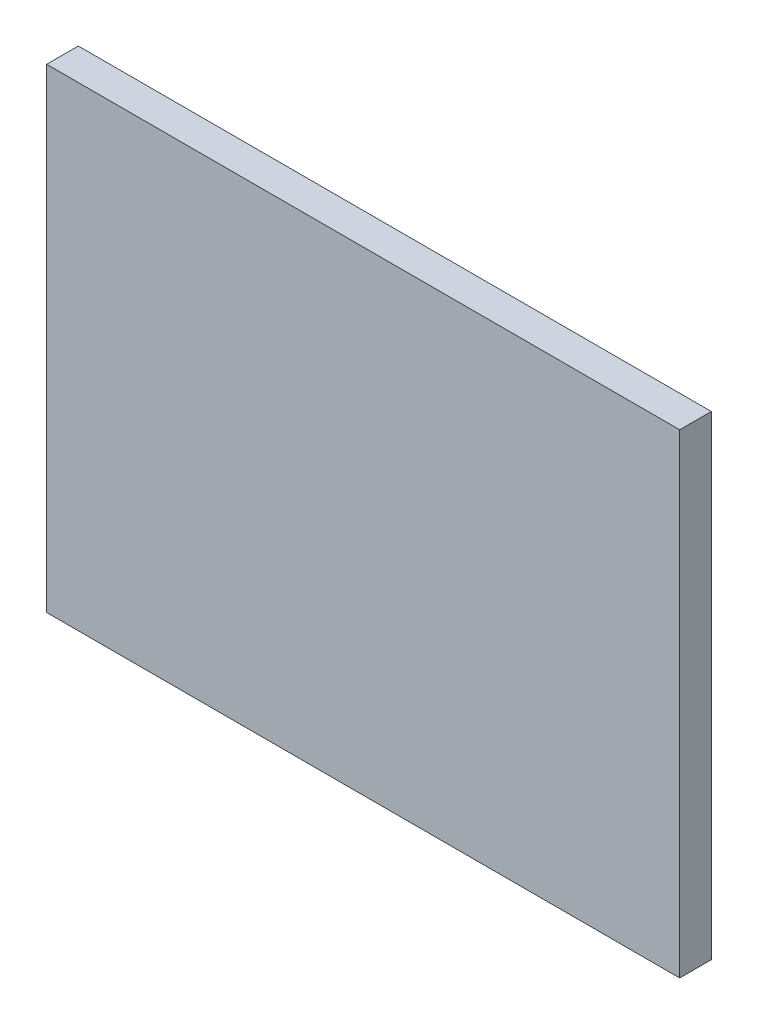
ISO-10303-21;
HEADER;
FILE_DESCRIPTION(('STEP AP214'),'2;1');
FILE_NAME('part.step','',(''),(''),'','','');
FILE_SCHEMA(('AUTOMOTIVE_DESIGN { 1 0 10303 214 1 1 1 1 }'));
ENDSEC;
DATA;
#1=APPLICATION_CONTEXT('core data for automotive mechanical design processes');
#2=APPLICATION_PROTOCOL_DEFINITION('international standard','automotive_design',2000,#1);
#3=PRODUCT_CONTEXT('',#1,'mechanical');
#4=PRODUCT('Part','Part','',(#3));
#5=PRODUCT_RELATED_PRODUCT_CATEGORY('part','',(#4));
#6=PRODUCT_DEFINITION_FORMATION('','',#4);
#7=PRODUCT_DEFINITION_CONTEXT('part definition',#1,'design');
#8=PRODUCT_DEFINITION('design','',#6,#7);
#9=PRODUCT_DEFINITION_SHAPE('','',#8);
#10=(LENGTH_UNIT() NAMED_UNIT(*) SI_UNIT(.MILLI.,.METRE.));
#11=(NAMED_UNIT(*) PLANE_ANGLE_UNIT() SI_UNIT($,.RADIAN.));
#12=(NAMED_UNIT(*) SI_UNIT($,.STERADIAN.) SOLID_ANGLE_UNIT());
#13=UNCERTAINTY_MEASURE_WITH_UNIT(LENGTH_MEASURE(1.E-05),#10,'distance_accuracy_value','');
#14=(GEOMETRIC_REPRESENTATION_CONTEXT(3) GLOBAL_UNCERTAINTY_ASSIGNED_CONTEXT((#13)) GLOBAL_UNIT_ASSIGNED_CONTEXT((#10,
#11,#12)) REPRESENTATION_CONTEXT('',''));
#15=CARTESIAN_POINT('',(0.,0.,0.));
#16=DIRECTION('',(0.,0.,1.));
#17=DIRECTION('',(1.,0.,0.));
#18=AXIS2_PLACEMENT_3D('',#15,#16,#17);
#19=CARTESIAN_POINT('',(100.,75.,10.));
#20=DIRECTION('',(-1.,0.,0.));
#21=DIRECTION('',(0.,-1.,0.));
#22=AXIS2_PLACEMENT_3D('',#19,#20,#21);
#23=PLANE('',#22);
#24=DIRECTION('',(0.,1.,0.));
#25=VECTOR('',#24,1.);
#26=CARTESIAN_POINT('',(100.,75.,0.));
#27=LINE('',#26,#25);
#28=CARTESIAN_POINT('',(100.,-75.,0.));
#29=VERTEX_POINT('',#28);
#30=CARTESIAN_POINT('',(100.,75.,0.));
#31=VERTEX_POINT('',#30);
#32=EDGE_CURVE('E115',#29,#31,#27,.T.);
#33=ORIENTED_EDGE('',*,*,#32,.T.);
#34=DIRECTION('',(0.,0.,-1.));
#35=VECTOR('',#34,1.);
#36=CARTESIAN_POINT('',(100.,75.,10.));
#37=LINE('',#36,#35);
#38=CARTESIAN_POINT('',(100.,75.,10.));
#39=VERTEX_POINT('',#38);
#40=EDGE_CURVE('E104',#39,#31,#37,.T.);
#41=ORIENTED_EDGE('',*,*,#40,.F.);
#42=DIRECTION('',(0.,1.,0.));
#43=VECTOR('',#42,1.);
#44=CARTESIAN_POINT('',(100.,75.,10.));
#45=LINE('',#44,#43);
#46=CARTESIAN_POINT('',(100.,-75.,10.));
#47=VERTEX_POINT('',#46);
#48=EDGE_CURVE('E96',#47,#39,#45,.T.);
#49=ORIENTED_EDGE('',*,*,#48,.F.);
#50=DIRECTION('',(0.,0.,-1.));
#51=VECTOR('',#50,1.);
#52=CARTESIAN_POINT('',(100.,-75.,10.));
#53=LINE('',#52,#51);
#54=EDGE_CURVE('E111',#47,#29,#53,.T.);
#55=ORIENTED_EDGE('',*,*,#54,.T.);
#56=EDGE_LOOP('',(#33,#41,#49,#55));
#57=FACE_BOUND('',#56,.T.);
#58=ADVANCED_FACE('F43',(#57),#23,.F.);
#59=CARTESIAN_POINT('',(-100.,75.,10.));
#60=DIRECTION('',(0.,-1.,0.));
#61=DIRECTION('',(0.,0.,-1.));
#62=AXIS2_PLACEMENT_3D('',#59,#60,#61);
#63=PLANE('',#62);
#64=DIRECTION('',(-1.,0.,0.));
#65=VECTOR('',#64,1.);
#66=CARTESIAN_POINT('',(-100.,75.,0.));
#67=LINE('',#66,#65);
#68=CARTESIAN_POINT('',(-100.,75.,0.));
#69=VERTEX_POINT('',#68);
#70=EDGE_CURVE('E102',#31,#69,#67,.T.);
#71=ORIENTED_EDGE('',*,*,#70,.T.);
#72=DIRECTION('',(0.,0.,-1.));
#73=VECTOR('',#72,1.);
#74=CARTESIAN_POINT('',(-100.,75.,10.));
#75=LINE('',#74,#73);
#76=CARTESIAN_POINT('',(-100.,75.,10.));
#77=VERTEX_POINT('',#76);
#78=EDGE_CURVE('E100',#77,#69,#75,.T.);
#79=ORIENTED_EDGE('',*,*,#78,.F.);
#80=DIRECTION('',(-1.,0.,0.));
#81=VECTOR('',#80,1.);
#82=CARTESIAN_POINT('',(-100.,75.,10.));
#83=LINE('',#82,#81);
#84=EDGE_CURVE('E91',#39,#77,#83,.T.);
#85=ORIENTED_EDGE('',*,*,#84,.F.);
#86=ORIENTED_EDGE('',*,*,#40,.T.);
#87=EDGE_LOOP('',(#71,#79,#85,#86));
#88=FACE_BOUND('',#87,.T.);
#89=ADVANCED_FACE('F101',(#88),#63,.F.);
#90=CARTESIAN_POINT('',(-100.,75.,10.));
#91=DIRECTION('',(1.,0.,0.));
#92=DIRECTION('',(0.,1.,0.));
#93=AXIS2_PLACEMENT_3D('',#90,#91,#92);
#94=PLANE('',#93);
#95=DIRECTION('',(0.,-1.,0.));
#96=VECTOR('',#95,1.);
#97=CARTESIAN_POINT('',(-100.,75.,0.));
#98=LINE('',#97,#96);
#99=CARTESIAN_POINT('',(-100.,-75.,0.));
#100=VERTEX_POINT('',#99);
#101=EDGE_CURVE('E77',#69,#100,#98,.T.);
#102=ORIENTED_EDGE('',*,*,#101,.T.);
#103=DIRECTION('',(0.,0.,-1.));
#104=VECTOR('',#103,1.);
#105=CARTESIAN_POINT('',(-100.,-75.,10.));
#106=LINE('',#105,#104);
#107=CARTESIAN_POINT('',(-100.,-75.,10.));
#108=VERTEX_POINT('',#107);
#109=EDGE_CURVE('E105',#108,#100,#106,.T.);
#110=ORIENTED_EDGE('',*,*,#109,.F.);
#111=DIRECTION('',(0.,-1.,0.));
#112=VECTOR('',#111,1.);
#113=CARTESIAN_POINT('',(-100.,75.,10.));
#114=LINE('',#113,#112);
#115=EDGE_CURVE('E94',#77,#108,#114,.T.);
#116=ORIENTED_EDGE('',*,*,#115,.F.);
#117=ORIENTED_EDGE('',*,*,#78,.T.);
#118=EDGE_LOOP('',(#102,#110,#116,#117));
#119=FACE_BOUND('',#118,.T.);
#120=ADVANCED_FACE('F107',(#119),#94,.F.);
#121=CARTESIAN_POINT('',(-100.,-75.,10.));
#122=DIRECTION('',(0.,1.,0.));
#123=DIRECTION('',(0.,0.,1.));
#124=AXIS2_PLACEMENT_3D('',#121,#122,#123);
#125=PLANE('',#124);
#126=DIRECTION('',(1.,0.,0.));
#127=VECTOR('',#126,1.);
#128=CARTESIAN_POINT('',(-100.,-75.,0.));
#129=LINE('',#128,#127);
#130=EDGE_CURVE('E83',#100,#29,#129,.T.);
#131=ORIENTED_EDGE('',*,*,#130,.T.);
#132=ORIENTED_EDGE('',*,*,#54,.F.);
#133=DIRECTION('',(1.,0.,0.));
#134=VECTOR('',#133,1.);
#135=CARTESIAN_POINT('',(-100.,-75.,10.));
#136=LINE('',#135,#134);
#137=EDGE_CURVE('E60',#108,#47,#136,.T.);
#138=ORIENTED_EDGE('',*,*,#137,.F.);
#139=ORIENTED_EDGE('',*,*,#109,.T.);
#140=EDGE_LOOP('',(#131,#132,#138,#139));
#141=FACE_BOUND('',#140,.T.);
#142=ADVANCED_FACE('F144',(#141),#125,.F.);
#143=CARTESIAN_POINT('',(0.,0.,10.));
#144=DIRECTION('',(0.,0.,1.));
#145=DIRECTION('',(1.,0.,0.));
#146=AXIS2_PLACEMENT_3D('',#143,#144,#145);
#147=PLANE('',#146);
#148=ORIENTED_EDGE('',*,*,#48,.T.);
#149=ORIENTED_EDGE('',*,*,#84,.T.);
#150=ORIENTED_EDGE('',*,*,#115,.T.);
#151=ORIENTED_EDGE('',*,*,#137,.T.);
#152=EDGE_LOOP('',(#148,#149,#150,#151));
#153=FACE_BOUND('',#152,.T.);
#154=ADVANCED_FACE('F92',(#153),#147,.T.);
#155=CARTESIAN_POINT('',(0.,0.,0.));
#156=DIRECTION('',(0.,0.,1.));
#157=DIRECTION('',(1.,0.,0.));
#158=AXIS2_PLACEMENT_3D('',#155,#156,#157);
#159=PLANE('',#158);
#160=CARTESIAN_POINT('',(-28.,0.,0.));
#161=DIRECTION('',(0.,0.,1.));
#162=DIRECTION('',(1.,0.,0.));
#163=AXIS2_PLACEMENT_3D('',#160,#161,#162);
#164=CIRCLE('',#163,2.5);
#165=CARTESIAN_POINT('',(-25.5,0.,0.));
#166=VERTEX_POINT('',#165);
#167=EDGE_CURVE('E11',#166,#166,#164,.F.);
#168=ORIENTED_EDGE('',*,*,#167,.F.);
#169=EDGE_LOOP('',(#168));
#170=FACE_BOUND('',#169,.T.);
#171=CARTESIAN_POINT('',(0.,0.,0.));
#172=DIRECTION('',(0.,0.,1.));
#173=DIRECTION('',(1.,0.,0.));
#174=AXIS2_PLACEMENT_3D('',#171,#172,#173);
#175=CIRCLE('',#174,2.5);
#176=CARTESIAN_POINT('',(2.5,0.,0.));
#177=VERTEX_POINT('',#176);
#178=EDGE_CURVE('E52',#177,#177,#175,.F.);
#179=ORIENTED_EDGE('',*,*,#178,.F.);
#180=EDGE_LOOP('',(#179));
#181=FACE_BOUND('',#180,.T.);
#182=ORIENTED_EDGE('',*,*,#32,.F.);
#183=ORIENTED_EDGE('',*,*,#130,.F.);
#184=ORIENTED_EDGE('',*,*,#101,.F.);
#185=ORIENTED_EDGE('',*,*,#70,.F.);
#186=EDGE_LOOP('',(#182,#183,#184,#185));
#187=FACE_BOUND('',#186,.T.);
#188=ADVANCED_FACE('F137',(#170,#181,#187),#159,.F.);
#189=CARTESIAN_POINT('',(0.,0.,-10.));
#190=DIRECTION('',(0.,0.,1.));
#191=DIRECTION('',(1.,0.,0.));
#192=AXIS2_PLACEMENT_3D('',#189,#190,#191);
#193=CYLINDRICAL_SURFACE('',#192,2.5);
#194=CARTESIAN_POINT('',(0.,0.,-10.));
#195=DIRECTION('',(0.,0.,-1.));
#196=DIRECTION('',(-1.,0.,0.));
#197=AXIS2_PLACEMENT_3D('',#194,#195,#196);
#198=CIRCLE('',#197,2.5);
#199=CARTESIAN_POINT('',(-2.5,0.,-10.));
#200=VERTEX_POINT('',#199);
#201=EDGE_CURVE('E119',#200,#200,#198,.T.);
#202=ORIENTED_EDGE('',*,*,#201,.F.);
#203=EDGE_LOOP('',(#202));
#204=FACE_BOUND('',#203,.T.);
#205=ORIENTED_EDGE('',*,*,#178,.T.);
#206=EDGE_LOOP('',(#205));
#207=FACE_BOUND('',#206,.T.);
#208=ADVANCED_FACE('F135',(#204,#207),#193,.T.);
#209=CARTESIAN_POINT('',(0.,0.,-10.));
#210=DIRECTION('',(0.,0.,-1.));
#211=DIRECTION('',(-1.,0.,0.));
#212=AXIS2_PLACEMENT_3D('',#209,#210,#211);
#213=PLANE('',#212);
#214=ORIENTED_EDGE('',*,*,#201,.T.);
#215=EDGE_LOOP('',(#214));
#216=FACE_BOUND('',#215,.T.);
#217=ADVANCED_FACE('F189',(#216),#213,.T.);
#218=CARTESIAN_POINT('',(-28.,0.,-10.));
#219=DIRECTION('',(0.,0.,1.));
#220=DIRECTION('',(1.,0.,0.));
#221=AXIS2_PLACEMENT_3D('',#218,#219,#220);
#222=CYLINDRICAL_SURFACE('',#221,2.5);
#223=CARTESIAN_POINT('',(-28.,0.,-10.));
#224=DIRECTION('',(0.,0.,-1.));
#225=DIRECTION('',(-1.,0.,0.));
#226=AXIS2_PLACEMENT_3D('',#223,#224,#225);
#227=CIRCLE('',#226,2.5);
#228=CARTESIAN_POINT('',(-30.5,0.,-10.));
#229=VERTEX_POINT('',#228);
#230=EDGE_CURVE('E250',#229,#229,#227,.T.);
#231=ORIENTED_EDGE('',*,*,#230,.F.);
#232=EDGE_LOOP('',(#231));
#233=FACE_BOUND('',#232,.T.);
#234=ORIENTED_EDGE('',*,*,#167,.T.);
#235=EDGE_LOOP('',(#234));
#236=FACE_BOUND('',#235,.T.);
#237=ADVANCED_FACE('F200',(#233,#236),#222,.T.);
#238=CARTESIAN_POINT('',(-28.,0.,-10.));
#239=DIRECTION('',(0.,0.,-1.));
#240=DIRECTION('',(-1.,0.,0.));
#241=AXIS2_PLACEMENT_3D('',#238,#239,#240);
#242=PLANE('',#241);
#243=ORIENTED_EDGE('',*,*,#230,.T.);
#244=EDGE_LOOP('',(#243));
#245=FACE_BOUND('',#244,.T.);
#246=ADVANCED_FACE('F211',(#245),#242,.T.);
#247=CLOSED_SHELL('',(#58,#89,#120,#142,#154,#188,#208,#217,#237,#246));
#248=MANIFOLD_SOLID_BREP('B2',#247);
#249=ADVANCED_BREP_SHAPE_REPRESENTATION('',(#18,#248),#14);
#250=SHAPE_DEFINITION_REPRESENTATION(#9,#249);
ENDSEC;
END-ISO-10303-21;
